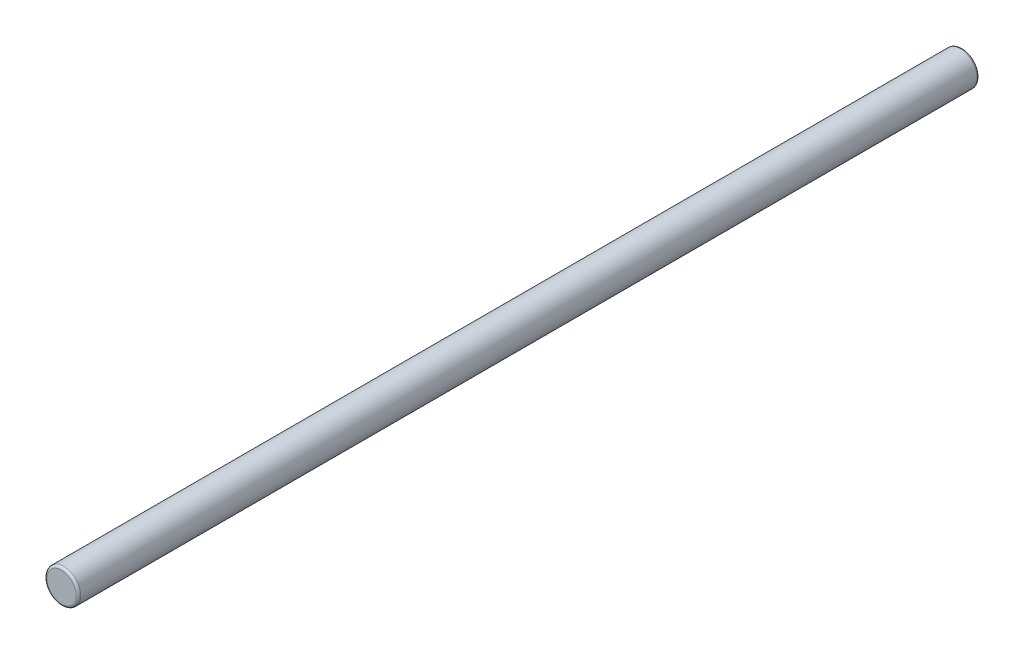
ISO-10303-21;
HEADER;
FILE_DESCRIPTION(('STEP AP214'),'2;1');
FILE_NAME('part.step','',(''),(''),'','','');
FILE_SCHEMA(('AUTOMOTIVE_DESIGN { 1 0 10303 214 1 1 1 1 }'));
ENDSEC;
DATA;
#1=APPLICATION_CONTEXT('core data for automotive mechanical design processes');
#2=APPLICATION_PROTOCOL_DEFINITION('international standard','automotive_design',2000,#1);
#3=PRODUCT_CONTEXT('',#1,'mechanical');
#4=PRODUCT('Part','Part','',(#3));
#5=PRODUCT_RELATED_PRODUCT_CATEGORY('part','',(#4));
#6=PRODUCT_DEFINITION_FORMATION('','',#4);
#7=PRODUCT_DEFINITION_CONTEXT('part definition',#1,'design');
#8=PRODUCT_DEFINITION('design','',#6,#7);
#9=PRODUCT_DEFINITION_SHAPE('','',#8);
#10=(LENGTH_UNIT() NAMED_UNIT(*) SI_UNIT(.MILLI.,.METRE.));
#11=(NAMED_UNIT(*) PLANE_ANGLE_UNIT() SI_UNIT($,.RADIAN.));
#12=(NAMED_UNIT(*) SI_UNIT($,.STERADIAN.) SOLID_ANGLE_UNIT());
#13=UNCERTAINTY_MEASURE_WITH_UNIT(LENGTH_MEASURE(1.E-05),#10,'distance_accuracy_value','');
#14=(GEOMETRIC_REPRESENTATION_CONTEXT(3) GLOBAL_UNCERTAINTY_ASSIGNED_CONTEXT((#13)) GLOBAL_UNIT_ASSIGNED_CONTEXT((#10,
#11,#12)) REPRESENTATION_CONTEXT('',''));
#15=CARTESIAN_POINT('',(0.,0.,0.));
#16=DIRECTION('',(0.,0.,1.));
#17=DIRECTION('',(1.,0.,0.));
#18=AXIS2_PLACEMENT_3D('',#15,#16,#17);
#19=CARTESIAN_POINT('',(0.,0.,40.));
#20=DIRECTION('',(0.,0.,-1.));
#21=DIRECTION('',(-1.,0.,0.));
#22=AXIS2_PLACEMENT_3D('',#19,#20,#21);
#23=CYLINDRICAL_SURFACE('',#22,0.75);
#24=CARTESIAN_POINT('',(0.,0.,0.100000000000003));
#25=DIRECTION('',(0.,0.,1.));
#26=DIRECTION('',(1.,0.,0.));
#27=AXIS2_PLACEMENT_3D('',#24,#25,#26);
#28=CIRCLE('',#27,0.75);
#29=CARTESIAN_POINT('',(0.75,0.,0.100000000000003));
#30=VERTEX_POINT('',#29);
#31=EDGE_CURVE('E38',#30,#30,#28,.T.);
#32=ORIENTED_EDGE('',*,*,#31,.T.);
#33=EDGE_LOOP('',(#32));
#34=FACE_BOUND('',#33,.T.);
#35=CARTESIAN_POINT('',(0.,0.,39.9));
#36=DIRECTION('',(0.,0.,1.));
#37=DIRECTION('',(1.,0.,0.));
#38=AXIS2_PLACEMENT_3D('',#35,#36,#37);
#39=CIRCLE('',#38,0.75);
#40=CARTESIAN_POINT('',(0.75,0.,39.9));
#41=VERTEX_POINT('',#40);
#42=EDGE_CURVE('E42',#41,#41,#39,.F.);
#43=ORIENTED_EDGE('',*,*,#42,.T.);
#44=EDGE_LOOP('',(#43));
#45=FACE_BOUND('',#44,.T.);
#46=ADVANCED_FACE('F31',(#34,#45),#23,.T.);
#47=CARTESIAN_POINT('',(0.,0.,40.));
#48=DIRECTION('',(0.,0.,1.));
#49=DIRECTION('',(1.,0.,0.));
#50=AXIS2_PLACEMENT_3D('',#47,#48,#49);
#51=PLANE('',#50);
#52=CARTESIAN_POINT('',(0.,0.,40.));
#53=DIRECTION('',(0.,0.,1.));
#54=DIRECTION('',(1.,0.,0.));
#55=AXIS2_PLACEMENT_3D('',#52,#53,#54);
#56=CIRCLE('',#55,0.65);
#57=CARTESIAN_POINT('',(0.65,0.,40.));
#58=VERTEX_POINT('',#57);
#59=EDGE_CURVE('E46',#58,#58,#56,.T.);
#60=ORIENTED_EDGE('',*,*,#59,.T.);
#61=EDGE_LOOP('',(#60));
#62=FACE_BOUND('',#61,.T.);
#63=ADVANCED_FACE('F52',(#62),#51,.T.);
#64=CARTESIAN_POINT('',(0.,0.,0.));
#65=DIRECTION('',(0.,0.,1.));
#66=DIRECTION('',(1.,0.,0.));
#67=AXIS2_PLACEMENT_3D('',#64,#65,#66);
#68=PLANE('',#67);
#69=CARTESIAN_POINT('',(0.,0.,0.));
#70=DIRECTION('',(0.,0.,1.));
#71=DIRECTION('',(1.,0.,0.));
#72=AXIS2_PLACEMENT_3D('',#69,#70,#71);
#73=CIRCLE('',#72,0.65);
#74=CARTESIAN_POINT('',(0.65,0.,0.));
#75=VERTEX_POINT('',#74);
#76=EDGE_CURVE('E10',#75,#75,#73,.F.);
#77=ORIENTED_EDGE('',*,*,#76,.T.);
#78=EDGE_LOOP('',(#77));
#79=FACE_BOUND('',#78,.T.);
#80=ADVANCED_FACE('F56',(#79),#68,.F.);
#81=CARTESIAN_POINT('',(0.,0.,39.9));
#82=DIRECTION('',(0.,0.,1.));
#83=DIRECTION('',(1.,0.,0.));
#84=AXIS2_PLACEMENT_3D('',#81,#82,#83);
#85=TOROIDAL_SURFACE('',#84,0.65,0.1);
#86=ORIENTED_EDGE('',*,*,#42,.F.);
#87=EDGE_LOOP('',(#86));
#88=FACE_BOUND('',#87,.T.);
#89=ORIENTED_EDGE('',*,*,#59,.F.);
#90=EDGE_LOOP('',(#89));
#91=FACE_BOUND('',#90,.T.);
#92=ADVANCED_FACE('F54',(#88,#91),#85,.T.);
#93=CARTESIAN_POINT('',(0.,0.,0.100000000000003));
#94=DIRECTION('',(0.,0.,1.));
#95=DIRECTION('',(1.,0.,0.));
#96=AXIS2_PLACEMENT_3D('',#93,#94,#95);
#97=TOROIDAL_SURFACE('',#96,0.65,0.1);
#98=ORIENTED_EDGE('',*,*,#76,.F.);
#99=EDGE_LOOP('',(#98));
#100=FACE_BOUND('',#99,.T.);
#101=ORIENTED_EDGE('',*,*,#31,.F.);
#102=EDGE_LOOP('',(#101));
#103=FACE_BOUND('',#102,.T.);
#104=ADVANCED_FACE('F33',(#100,#103),#97,.T.);
#105=CLOSED_SHELL('',(#46,#63,#80,#92,#104));
#106=MANIFOLD_SOLID_BREP('B2',#105);
#107=ADVANCED_BREP_SHAPE_REPRESENTATION('',(#18,#106),#14);
#108=SHAPE_DEFINITION_REPRESENTATION(#9,#107);
ENDSEC;
END-ISO-10303-21;
